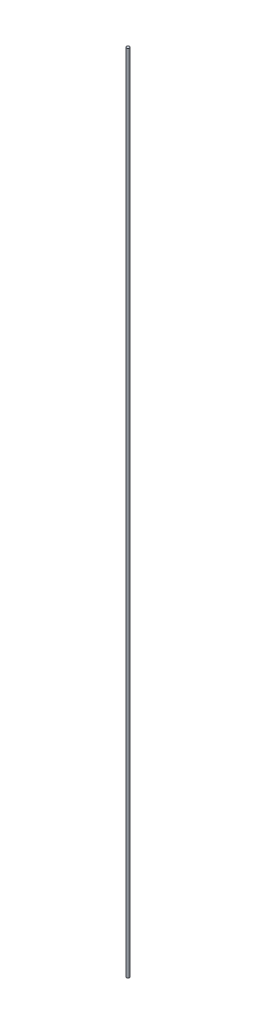
ISO-10303-21;
HEADER;
FILE_DESCRIPTION(('STEP AP214'),'2;1');
FILE_NAME('part.step','',(''),(''),'','','');
FILE_SCHEMA(('AUTOMOTIVE_DESIGN { 1 0 10303 214 1 1 1 1 }'));
ENDSEC;
DATA;
#1=APPLICATION_CONTEXT('core data for automotive mechanical design processes');
#2=APPLICATION_PROTOCOL_DEFINITION('international standard','automotive_design',2000,#1);
#3=PRODUCT_CONTEXT('',#1,'mechanical');
#4=PRODUCT('Part','Part','',(#3));
#5=PRODUCT_RELATED_PRODUCT_CATEGORY('part','',(#4));
#6=PRODUCT_DEFINITION_FORMATION('','',#4);
#7=PRODUCT_DEFINITION_CONTEXT('part definition',#1,'design');
#8=PRODUCT_DEFINITION('design','',#6,#7);
#9=PRODUCT_DEFINITION_SHAPE('','',#8);
#10=(LENGTH_UNIT() NAMED_UNIT(*) SI_UNIT(.MILLI.,.METRE.));
#11=(NAMED_UNIT(*) PLANE_ANGLE_UNIT() SI_UNIT($,.RADIAN.));
#12=(NAMED_UNIT(*) SI_UNIT($,.STERADIAN.) SOLID_ANGLE_UNIT());
#13=UNCERTAINTY_MEASURE_WITH_UNIT(LENGTH_MEASURE(1.E-05),#10,'distance_accuracy_value','');
#14=(GEOMETRIC_REPRESENTATION_CONTEXT(3) GLOBAL_UNCERTAINTY_ASSIGNED_CONTEXT((#13)) GLOBAL_UNIT_ASSIGNED_CONTEXT((#10,
#11,#12)) REPRESENTATION_CONTEXT('',''));
#15=CARTESIAN_POINT('',(0.,0.,0.));
#16=DIRECTION('',(0.,0.,1.));
#17=DIRECTION('',(1.,0.,0.));
#18=AXIS2_PLACEMENT_3D('',#15,#16,#17);
#19=CARTESIAN_POINT('',(0.,6852.53646,0.));
#20=DIRECTION('',(0.,-1.,0.));
#21=DIRECTION('',(0.,0.,-1.));
#22=AXIS2_PLACEMENT_3D('',#19,#20,#21);
#23=CYLINDRICAL_SURFACE('',#22,12.7);
#24=CARTESIAN_POINT('',(0.,6852.53646,0.));
#25=DIRECTION('',(0.,1.,0.));
#26=DIRECTION('',(0.,0.,1.));
#27=AXIS2_PLACEMENT_3D('',#24,#25,#26);
#28=CIRCLE('',#27,12.7);
#29=CARTESIAN_POINT('',(0.,6852.53646,-12.7));
#30=VERTEX_POINT('',#29);
#31=EDGE_CURVE('E10',#30,#30,#28,.T.);
#32=CARTESIAN_POINT('',(0.,0.,0.));
#33=DIRECTION('',(0.,1.,0.));
#34=DIRECTION('',(0.,0.,1.));
#35=AXIS2_PLACEMENT_3D('',#32,#33,#34);
#36=CIRCLE('',#35,12.7);
#37=CARTESIAN_POINT('',(0.,-8.88178419700125E-13,-12.7));
#38=VERTEX_POINT('',#37);
#39=EDGE_CURVE('E44',#38,#38,#36,.T.);
#40=CARTESIAN_POINT('',(0.,6852.53646,-12.7));
#41=CARTESIAN_POINT('',(0.,6781.155871875,-12.7));
#42=CARTESIAN_POINT('',(0.,6709.77528375,-12.7));
#43=CARTESIAN_POINT('',(0.,6567.0141075,-12.7));
#44=CARTESIAN_POINT('',(0.,6495.633519375,-12.7));
#45=CARTESIAN_POINT('',(0.,6352.872343125,-12.7));
#46=CARTESIAN_POINT('',(0.,6281.491755,-12.7));
#47=CARTESIAN_POINT('',(0.,6138.73057875,-12.7));
#48=CARTESIAN_POINT('',(0.,6067.349990625,-12.7));
#49=CARTESIAN_POINT('',(0.,5924.588814375,-12.7));
#50=CARTESIAN_POINT('',(0.,5853.20822625,-12.7));
#51=CARTESIAN_POINT('',(0.,5710.44705,-12.7));
#52=CARTESIAN_POINT('',(0.,5639.066461875,-12.7));
#53=CARTESIAN_POINT('',(0.,5496.305285625,-12.7));
#54=CARTESIAN_POINT('',(0.,5424.9246975,-12.7));
#55=CARTESIAN_POINT('',(0.,5282.16352125,-12.7));
#56=CARTESIAN_POINT('',(0.,5210.782933125,-12.7));
#57=CARTESIAN_POINT('',(0.,5068.021756875,-12.7));
#58=CARTESIAN_POINT('',(0.,4996.64116875,-12.7));
#59=CARTESIAN_POINT('',(0.,4853.8799925,-12.7));
#60=CARTESIAN_POINT('',(0.,4782.499404375,-12.7));
#61=CARTESIAN_POINT('',(0.,4639.738228125,-12.7));
#62=CARTESIAN_POINT('',(0.,4568.35764,-12.7));
#63=CARTESIAN_POINT('',(0.,4425.59646375,-12.7));
#64=CARTESIAN_POINT('',(0.,4354.215875625,-12.7));
#65=CARTESIAN_POINT('',(0.,4211.454699375,-12.7));
#66=CARTESIAN_POINT('',(0.,4140.07411125,-12.7));
#67=CARTESIAN_POINT('',(0.,3997.312935,-12.7));
#68=CARTESIAN_POINT('',(0.,3925.932346875,-12.7));
#69=CARTESIAN_POINT('',(0.,3783.171170625,-12.7));
#70=CARTESIAN_POINT('',(0.,3711.7905825,-12.7));
#71=CARTESIAN_POINT('',(0.,3569.02940625,-12.7));
#72=CARTESIAN_POINT('',(0.,3497.648818125,-12.7));
#73=CARTESIAN_POINT('',(0.,3354.887641875,-12.7));
#74=CARTESIAN_POINT('',(0.,3283.50705375,-12.7));
#75=CARTESIAN_POINT('',(0.,3140.7458775,-12.7));
#76=CARTESIAN_POINT('',(0.,3069.365289375,-12.7));
#77=CARTESIAN_POINT('',(0.,2926.604113125,-12.7));
#78=CARTESIAN_POINT('',(0.,2855.223525,-12.7));
#79=CARTESIAN_POINT('',(0.,2712.46234875,-12.7));
#80=CARTESIAN_POINT('',(0.,2641.081760625,-12.7));
#81=CARTESIAN_POINT('',(0.,2498.320584375,-12.7));
#82=CARTESIAN_POINT('',(0.,2426.93999625,-12.7));
#83=CARTESIAN_POINT('',(0.,2284.17882,-12.7));
#84=CARTESIAN_POINT('',(0.,2212.798231875,-12.7));
#85=CARTESIAN_POINT('',(0.,2070.037055625,-12.7));
#86=CARTESIAN_POINT('',(0.,1998.6564675,-12.7));
#87=CARTESIAN_POINT('',(0.,1855.89529125,-12.7));
#88=CARTESIAN_POINT('',(0.,1784.514703125,-12.7));
#89=CARTESIAN_POINT('',(0.,1641.753526875,-12.7));
#90=CARTESIAN_POINT('',(0.,1570.37293875,-12.7));
#91=CARTESIAN_POINT('',(0.,1427.6117625,-12.7));
#92=CARTESIAN_POINT('',(0.,1356.231174375,-12.7));
#93=CARTESIAN_POINT('',(0.,1213.469998125,-12.7));
#94=CARTESIAN_POINT('',(0.,1142.08941,-12.7));
#95=CARTESIAN_POINT('',(0.,999.328233749999,-12.7));
#96=CARTESIAN_POINT('',(0.,927.947645624999,-12.7));
#97=CARTESIAN_POINT('',(0.,785.186469374999,-12.7));
#98=CARTESIAN_POINT('',(0.,713.805881249999,-12.7));
#99=CARTESIAN_POINT('',(0.,571.044704999999,-12.7));
#100=CARTESIAN_POINT('',(0.,499.664116874999,-12.7));
#101=CARTESIAN_POINT('',(0.,356.902940624999,-12.7));
#102=CARTESIAN_POINT('',(0.,285.522352499999,-12.7));
#103=CARTESIAN_POINT('',(0.,142.761176249999,-12.7));
#104=CARTESIAN_POINT('',(0.,71.3805881249992,-12.7));
#105=CARTESIAN_POINT('',(0.,-8.88178419700125E-13,-12.7));
#106=B_SPLINE_CURVE_WITH_KNOTS('',3,(#40,#41,#42,#43,#44,#45,#46,#47,#48,#49,#50,#51,#52,#53,
#54,#55,#56,#57,#58,#59,#60,#61,#62,#63,#64,#65,#66,#67,#68,#69,#70,#71,#72,#73,#74,#75,#76,#77,
#78,#79,#80,#81,#82,#83,#84,#85,#86,#87,#88,#89,#90,#91,#92,#93,#94,#95,#96,#97,#98,#99,#100,
#101,#102,#103,#104,#105),.UNSPECIFIED.,.F.,.F.,(4,2,2,2,2,2,2,2,2,2,2,2,2,2,2,2,2,2,2,2,2,2,2,
2,2,2,2,2,2,2,2,2,4),(0.,214.141764374999,428.28352875,642.425293124999,856.567057499999,
1070.708821875,1284.85058625,1498.992350625,1713.134115,1927.275879375,2141.41764375,
2355.559408125,2569.7011725,2783.842936875,2997.98470125,3212.126465625,3426.26823,
3640.409994375,3854.55175875,4068.693523125,4282.8352875,4496.977051875,4711.11881625,
4925.260580625,5139.402345,5353.544109375,5567.68587375,5781.827638125,5995.9694025,
6210.111166875,6424.25293125,6638.394695625,6852.53646),.UNSPECIFIED.);
#107=EDGE_CURVE('BSEAM45',#30,#38,#106,.T.);
#108=ORIENTED_EDGE('',*,*,#31,.F.);
#109=ORIENTED_EDGE('',*,*,#39,.T.);
#110=ORIENTED_EDGE('',*,*,#107,.T.);
#111=ORIENTED_EDGE('',*,*,#107,.F.);
#112=EDGE_LOOP('',(#108,#110,#109,#111));
#113=FACE_BOUND('',#112,.T.);
#114=ADVANCED_FACE('F45',(#113),#23,.T.);
#115=CARTESIAN_POINT('',(0.,6852.53646,0.));
#116=DIRECTION('',(0.,1.,0.));
#117=DIRECTION('',(0.,0.,1.));
#118=AXIS2_PLACEMENT_3D('',#115,#116,#117);
#119=PLANE('',#118);
#120=ORIENTED_EDGE('',*,*,#31,.T.);
#121=EDGE_LOOP('',(#120));
#122=FACE_BOUND('',#121,.T.);
#123=ADVANCED_FACE('F60',(#122),#119,.T.);
#124=CARTESIAN_POINT('',(0.,0.,0.));
#125=DIRECTION('',(0.,1.,0.));
#126=DIRECTION('',(0.,0.,1.));
#127=AXIS2_PLACEMENT_3D('',#124,#125,#126);
#128=PLANE('',#127);
#129=ORIENTED_EDGE('',*,*,#39,.F.);
#130=EDGE_LOOP('',(#129));
#131=FACE_BOUND('',#130,.T.);
#132=ADVANCED_FACE('F54',(#131),#128,.F.);
#133=CLOSED_SHELL('',(#114,#123,#132));
#134=MANIFOLD_SOLID_BREP('B2',#133);
#135=ADVANCED_BREP_SHAPE_REPRESENTATION('',(#18,#134),#14);
#136=SHAPE_DEFINITION_REPRESENTATION(#9,#135);
ENDSEC;
END-ISO-10303-21;
